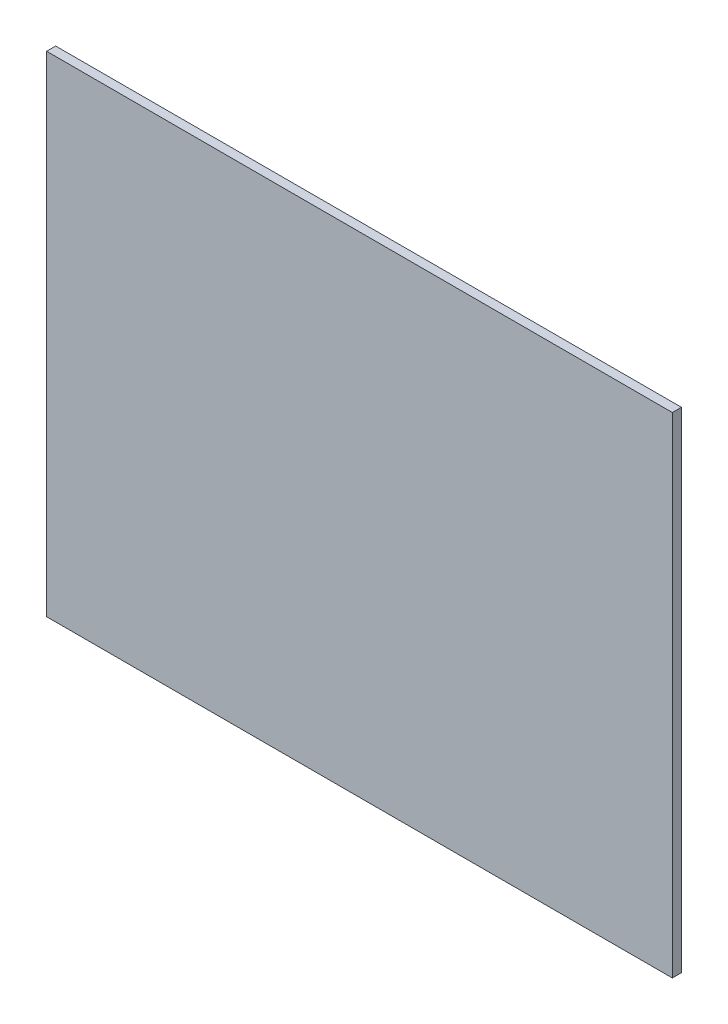
ISO-10303-21;
HEADER;
FILE_DESCRIPTION(('STEP AP214'),'2;1');
FILE_NAME('part.step','',(''),(''),'','','');
FILE_SCHEMA(('AUTOMOTIVE_DESIGN { 1 0 10303 214 1 1 1 1 }'));
ENDSEC;
DATA;
#1=APPLICATION_CONTEXT('core data for automotive mechanical design processes');
#2=APPLICATION_PROTOCOL_DEFINITION('international standard','automotive_design',2000,#1);
#3=PRODUCT_CONTEXT('',#1,'mechanical');
#4=PRODUCT('Part','Part','',(#3));
#5=PRODUCT_RELATED_PRODUCT_CATEGORY('part','',(#4));
#6=PRODUCT_DEFINITION_FORMATION('','',#4);
#7=PRODUCT_DEFINITION_CONTEXT('part definition',#1,'design');
#8=PRODUCT_DEFINITION('design','',#6,#7);
#9=PRODUCT_DEFINITION_SHAPE('','',#8);
#10=(LENGTH_UNIT() NAMED_UNIT(*) SI_UNIT(.MILLI.,.METRE.));
#11=(NAMED_UNIT(*) PLANE_ANGLE_UNIT() SI_UNIT($,.RADIAN.));
#12=(NAMED_UNIT(*) SI_UNIT($,.STERADIAN.) SOLID_ANGLE_UNIT());
#13=UNCERTAINTY_MEASURE_WITH_UNIT(LENGTH_MEASURE(1.E-05),#10,'distance_accuracy_value','');
#14=(GEOMETRIC_REPRESENTATION_CONTEXT(3) GLOBAL_UNCERTAINTY_ASSIGNED_CONTEXT((#13)) GLOBAL_UNIT_ASSIGNED_CONTEXT((#10,
#11,#12)) REPRESENTATION_CONTEXT('',''));
#15=CARTESIAN_POINT('',(0.,0.,0.));
#16=DIRECTION('',(0.,0.,1.));
#17=DIRECTION('',(1.,0.,0.));
#18=AXIS2_PLACEMENT_3D('',#15,#16,#17);
#19=CARTESIAN_POINT('',(0.,0.,5.));
#20=DIRECTION('',(0.,-1.,0.));
#21=DIRECTION('',(0.,0.,-1.));
#22=AXIS2_PLACEMENT_3D('',#19,#20,#21);
#23=PLANE('',#22);
#24=DIRECTION('',(-1.,0.,0.));
#25=VECTOR('',#24,1.);
#26=CARTESIAN_POINT('',(0.,0.,0.));
#27=LINE('',#26,#25);
#28=CARTESIAN_POINT('',(0.,0.,0.));
#29=VERTEX_POINT('',#28);
#30=CARTESIAN_POINT('',(-345.,0.,0.));
#31=VERTEX_POINT('',#30);
#32=EDGE_CURVE('E116',#29,#31,#27,.T.);
#33=ORIENTED_EDGE('',*,*,#32,.F.);
#34=DIRECTION('',(0.,0.,-1.));
#35=VECTOR('',#34,1.);
#36=CARTESIAN_POINT('',(0.,0.,5.));
#37=LINE('',#36,#35);
#38=CARTESIAN_POINT('',(0.,0.,5.));
#39=VERTEX_POINT('',#38);
#40=EDGE_CURVE('E11',#39,#29,#37,.T.);
#41=ORIENTED_EDGE('',*,*,#40,.F.);
#42=DIRECTION('',(-1.,0.,0.));
#43=VECTOR('',#42,1.);
#44=CARTESIAN_POINT('',(0.,0.,5.));
#45=LINE('',#44,#43);
#46=CARTESIAN_POINT('',(-345.,0.,5.));
#47=VERTEX_POINT('',#46);
#48=EDGE_CURVE('E108',#39,#47,#45,.T.);
#49=ORIENTED_EDGE('',*,*,#48,.T.);
#50=DIRECTION('',(0.,0.,-1.));
#51=VECTOR('',#50,1.);
#52=CARTESIAN_POINT('',(-345.,0.,5.));
#53=LINE('',#52,#51);
#54=EDGE_CURVE('E48',#47,#31,#53,.T.);
#55=ORIENTED_EDGE('',*,*,#54,.T.);
#56=EDGE_LOOP('',(#33,#41,#49,#55));
#57=FACE_BOUND('',#56,.T.);
#58=ADVANCED_FACE('F44',(#57),#23,.T.);
#59=CARTESIAN_POINT('',(0.,0.,5.));
#60=DIRECTION('',(-1.,0.,0.));
#61=DIRECTION('',(0.,0.,1.));
#62=AXIS2_PLACEMENT_3D('',#59,#60,#61);
#63=PLANE('',#62);
#64=DIRECTION('',(0.,1.,0.));
#65=VECTOR('',#64,1.);
#66=CARTESIAN_POINT('',(0.,0.,0.));
#67=LINE('',#66,#65);
#68=CARTESIAN_POINT('',(0.,270.,0.));
#69=VERTEX_POINT('',#68);
#70=EDGE_CURVE('E80',#29,#69,#67,.T.);
#71=ORIENTED_EDGE('',*,*,#70,.T.);
#72=DIRECTION('',(0.,0.,-1.));
#73=VECTOR('',#72,1.);
#74=CARTESIAN_POINT('',(0.,270.,5.));
#75=LINE('',#74,#73);
#76=CARTESIAN_POINT('',(0.,270.,5.));
#77=VERTEX_POINT('',#76);
#78=EDGE_CURVE('E54',#77,#69,#75,.T.);
#79=ORIENTED_EDGE('',*,*,#78,.F.);
#80=DIRECTION('',(0.,1.,0.));
#81=VECTOR('',#80,1.);
#82=CARTESIAN_POINT('',(0.,0.,5.));
#83=LINE('',#82,#81);
#84=EDGE_CURVE('E96',#39,#77,#83,.T.);
#85=ORIENTED_EDGE('',*,*,#84,.F.);
#86=ORIENTED_EDGE('',*,*,#40,.T.);
#87=EDGE_LOOP('',(#71,#79,#85,#86));
#88=FACE_BOUND('',#87,.T.);
#89=ADVANCED_FACE('F135',(#88),#63,.F.);
#90=CARTESIAN_POINT('',(0.,270.,5.));
#91=DIRECTION('',(0.,-1.,0.));
#92=DIRECTION('',(0.,0.,-1.));
#93=AXIS2_PLACEMENT_3D('',#90,#91,#92);
#94=PLANE('',#93);
#95=DIRECTION('',(-1.,0.,0.));
#96=VECTOR('',#95,1.);
#97=CARTESIAN_POINT('',(0.,270.,0.));
#98=LINE('',#97,#96);
#99=CARTESIAN_POINT('',(-345.,270.,0.));
#100=VERTEX_POINT('',#99);
#101=EDGE_CURVE('E101',#69,#100,#98,.T.);
#102=ORIENTED_EDGE('',*,*,#101,.T.);
#103=DIRECTION('',(0.,0.,-1.));
#104=VECTOR('',#103,1.);
#105=CARTESIAN_POINT('',(-345.,270.,5.));
#106=LINE('',#105,#104);
#107=CARTESIAN_POINT('',(-345.,270.,5.));
#108=VERTEX_POINT('',#107);
#109=EDGE_CURVE('E102',#108,#100,#106,.T.);
#110=ORIENTED_EDGE('',*,*,#109,.F.);
#111=DIRECTION('',(-1.,0.,0.));
#112=VECTOR('',#111,1.);
#113=CARTESIAN_POINT('',(0.,270.,5.));
#114=LINE('',#113,#112);
#115=EDGE_CURVE('E91',#77,#108,#114,.T.);
#116=ORIENTED_EDGE('',*,*,#115,.F.);
#117=ORIENTED_EDGE('',*,*,#78,.T.);
#118=EDGE_LOOP('',(#102,#110,#116,#117));
#119=FACE_BOUND('',#118,.T.);
#120=ADVANCED_FACE('F105',(#119),#94,.F.);
#121=CARTESIAN_POINT('',(-345.,0.,5.));
#122=DIRECTION('',(-1.,0.,0.));
#123=DIRECTION('',(0.,0.,1.));
#124=AXIS2_PLACEMENT_3D('',#121,#122,#123);
#125=PLANE('',#124);
#126=DIRECTION('',(0.,1.,0.));
#127=VECTOR('',#126,1.);
#128=CARTESIAN_POINT('',(-345.,0.,0.));
#129=LINE('',#128,#127);
#130=EDGE_CURVE('E120',#31,#100,#129,.T.);
#131=ORIENTED_EDGE('',*,*,#130,.F.);
#132=ORIENTED_EDGE('',*,*,#54,.F.);
#133=DIRECTION('',(0.,1.,0.));
#134=VECTOR('',#133,1.);
#135=CARTESIAN_POINT('',(-345.,0.,5.));
#136=LINE('',#135,#134);
#137=EDGE_CURVE('E94',#47,#108,#136,.T.);
#138=ORIENTED_EDGE('',*,*,#137,.T.);
#139=ORIENTED_EDGE('',*,*,#109,.T.);
#140=EDGE_LOOP('',(#131,#132,#138,#139));
#141=FACE_BOUND('',#140,.T.);
#142=ADVANCED_FACE('F107',(#141),#125,.T.);
#143=CARTESIAN_POINT('',(0.,0.,5.));
#144=DIRECTION('',(0.,0.,-1.));
#145=DIRECTION('',(-1.,0.,0.));
#146=AXIS2_PLACEMENT_3D('',#143,#144,#145);
#147=PLANE('',#146);
#148=ORIENTED_EDGE('',*,*,#48,.F.);
#149=ORIENTED_EDGE('',*,*,#84,.T.);
#150=ORIENTED_EDGE('',*,*,#115,.T.);
#151=ORIENTED_EDGE('',*,*,#137,.F.);
#152=EDGE_LOOP('',(#148,#149,#150,#151));
#153=FACE_BOUND('',#152,.T.);
#154=ADVANCED_FACE('F92',(#153),#147,.F.);
#155=CARTESIAN_POINT('',(0.,0.,0.));
#156=DIRECTION('',(0.,0.,-1.));
#157=DIRECTION('',(-1.,0.,0.));
#158=AXIS2_PLACEMENT_3D('',#155,#156,#157);
#159=PLANE('',#158);
#160=ORIENTED_EDGE('',*,*,#32,.T.);
#161=ORIENTED_EDGE('',*,*,#130,.T.);
#162=ORIENTED_EDGE('',*,*,#101,.F.);
#163=ORIENTED_EDGE('',*,*,#70,.F.);
#164=EDGE_LOOP('',(#160,#161,#162,#163));
#165=FACE_BOUND('',#164,.T.);
#166=ADVANCED_FACE('F129',(#165),#159,.T.);
#167=CLOSED_SHELL('',(#58,#89,#120,#142,#154,#166));
#168=MANIFOLD_SOLID_BREP('B2',#167);
#169=ADVANCED_BREP_SHAPE_REPRESENTATION('',(#18,#168),#14);
#170=SHAPE_DEFINITION_REPRESENTATION(#9,#169);
ENDSEC;
END-ISO-10303-21;
